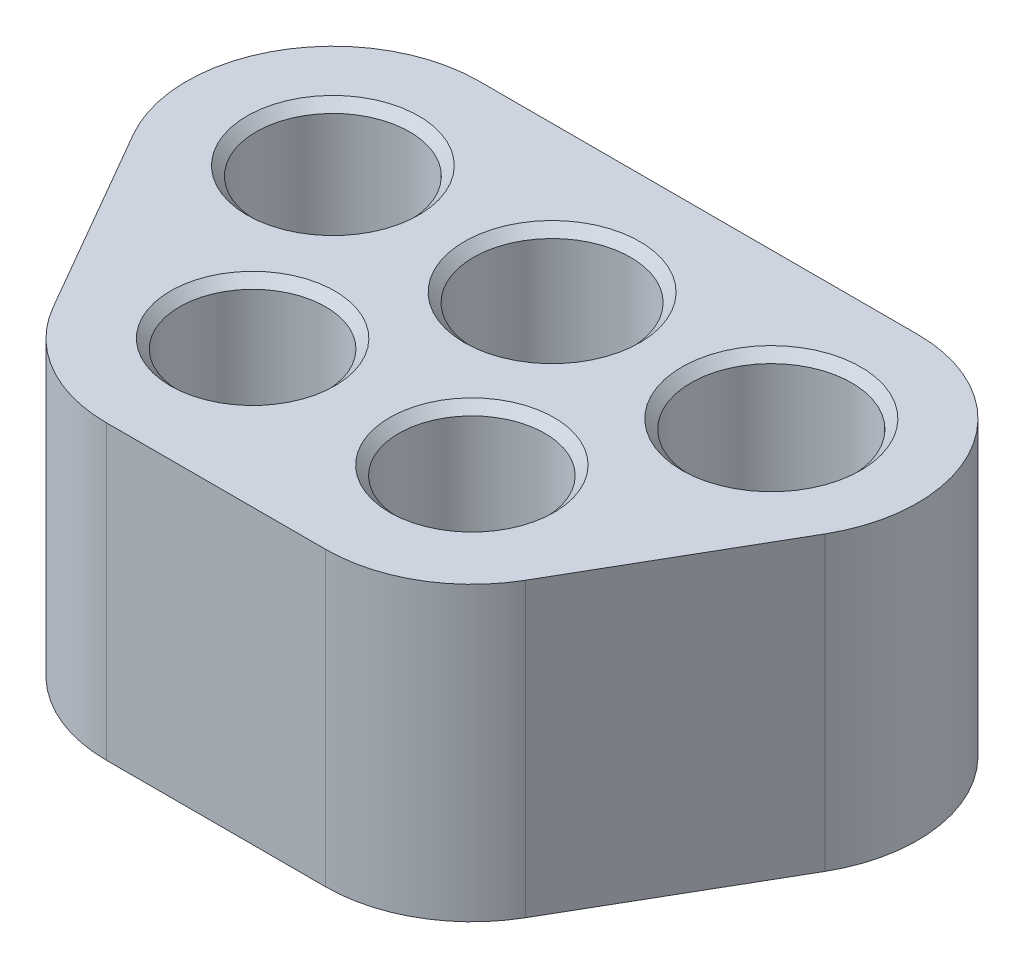
ISO-10303-21;
HEADER;
FILE_DESCRIPTION(('STEP AP214'),'2;1');
FILE_NAME('part.step','',(''),(''),'','','');
FILE_SCHEMA(('AUTOMOTIVE_DESIGN { 1 0 10303 214 1 1 1 1 }'));
ENDSEC;
DATA;
#1=APPLICATION_CONTEXT('core data for automotive mechanical design processes');
#2=APPLICATION_PROTOCOL_DEFINITION('international standard','automotive_design',2000,#1);
#3=PRODUCT_CONTEXT('',#1,'mechanical');
#4=PRODUCT('Part','Part','',(#3));
#5=PRODUCT_RELATED_PRODUCT_CATEGORY('part','',(#4));
#6=PRODUCT_DEFINITION_FORMATION('','',#4);
#7=PRODUCT_DEFINITION_CONTEXT('part definition',#1,'design');
#8=PRODUCT_DEFINITION('design','',#6,#7);
#9=PRODUCT_DEFINITION_SHAPE('','',#8);
#10=(LENGTH_UNIT() NAMED_UNIT(*) SI_UNIT(.MILLI.,.METRE.));
#11=(NAMED_UNIT(*) PLANE_ANGLE_UNIT() SI_UNIT($,.RADIAN.));
#12=(NAMED_UNIT(*) SI_UNIT($,.STERADIAN.) SOLID_ANGLE_UNIT());
#13=UNCERTAINTY_MEASURE_WITH_UNIT(LENGTH_MEASURE(1.E-05),#10,'distance_accuracy_value','');
#14=(GEOMETRIC_REPRESENTATION_CONTEXT(3) GLOBAL_UNCERTAINTY_ASSIGNED_CONTEXT((#13)) GLOBAL_UNIT_ASSIGNED_CONTEXT((#10,
#11,#12)) REPRESENTATION_CONTEXT('',''));
#15=CARTESIAN_POINT('',(0.,0.,0.));
#16=DIRECTION('',(0.,0.,1.));
#17=DIRECTION('',(1.,0.,0.));
#18=AXIS2_PLACEMENT_3D('',#15,#16,#17);
#19=CARTESIAN_POINT('',(0.,8.,0.));
#20=DIRECTION('',(0.,1.,0.));
#21=DIRECTION('',(0.,0.,1.));
#22=AXIS2_PLACEMENT_3D('',#19,#20,#21);
#23=PLANE('',#22);
#24=CARTESIAN_POINT('',(3.,8.,5.19615242270663));
#25=DIRECTION('',(0.,1.,0.));
#26=DIRECTION('',(0.,0.,1.));
#27=AXIS2_PLACEMENT_3D('',#24,#25,#26);
#28=CIRCLE('',#27,2.25000000000001);
#29=CARTESIAN_POINT('',(3.,8.,7.44615242270664));
#30=VERTEX_POINT('',#29);
#31=EDGE_CURVE('E182',#30,#30,#28,.F.);
#32=ORIENTED_EDGE('',*,*,#31,.T.);
#33=EDGE_LOOP('',(#32));
#34=FACE_BOUND('',#33,.T.);
#35=CARTESIAN_POINT('',(9.,8.,5.19615242270663));
#36=DIRECTION('',(0.,1.,0.));
#37=DIRECTION('',(0.,0.,1.));
#38=AXIS2_PLACEMENT_3D('',#35,#36,#37);
#39=CIRCLE('',#38,2.25000000000001);
#40=CARTESIAN_POINT('',(9.,8.,7.44615242270664));
#41=VERTEX_POINT('',#40);
#42=EDGE_CURVE('E179',#41,#41,#39,.F.);
#43=ORIENTED_EDGE('',*,*,#42,.T.);
#44=EDGE_LOOP('',(#43));
#45=FACE_BOUND('',#44,.T.);
#46=CARTESIAN_POINT('',(12.,8.,0.));
#47=DIRECTION('',(0.,1.,0.));
#48=DIRECTION('',(0.,0.,1.));
#49=AXIS2_PLACEMENT_3D('',#46,#47,#48);
#50=CIRCLE('',#49,2.45);
#51=CARTESIAN_POINT('',(12.,8.,2.45));
#52=VERTEX_POINT('',#51);
#53=EDGE_CURVE('E176',#52,#52,#50,.F.);
#54=ORIENTED_EDGE('',*,*,#53,.T.);
#55=EDGE_LOOP('',(#54));
#56=FACE_BOUND('',#55,.T.);
#57=CARTESIAN_POINT('',(6.,8.,0.));
#58=DIRECTION('',(0.,1.,0.));
#59=DIRECTION('',(0.,0.,1.));
#60=AXIS2_PLACEMENT_3D('',#57,#58,#59);
#61=CIRCLE('',#60,2.40000000000001);
#62=CARTESIAN_POINT('',(6.,8.,2.40000000000001));
#63=VERTEX_POINT('',#62);
#64=EDGE_CURVE('E173',#63,#63,#61,.F.);
#65=ORIENTED_EDGE('',*,*,#64,.T.);
#66=EDGE_LOOP('',(#65));
#67=FACE_BOUND('',#66,.T.);
#68=CARTESIAN_POINT('',(0.,8.,0.));
#69=DIRECTION('',(0.,1.,0.));
#70=DIRECTION('',(0.,0.,1.));
#71=AXIS2_PLACEMENT_3D('',#68,#69,#70);
#72=CIRCLE('',#71,2.35000000000001);
#73=CARTESIAN_POINT('',(0.,8.,2.35000000000001));
#74=VERTEX_POINT('',#73);
#75=EDGE_CURVE('E170',#74,#74,#72,.F.);
#76=ORIENTED_EDGE('',*,*,#75,.T.);
#77=EDGE_LOOP('',(#76));
#78=FACE_BOUND('',#77,.T.);
#79=DIRECTION('',(-1.,0.,0.));
#80=VECTOR('',#79,1.);
#81=CARTESIAN_POINT('',(18.9282032302755,8.,-4.));
#82=LINE('',#81,#80);
#83=CARTESIAN_POINT('',(12.,8.,-4.));
#84=VERTEX_POINT('',#83);
#85=CARTESIAN_POINT('',(0.,8.,-4.));
#86=VERTEX_POINT('',#85);
#87=EDGE_CURVE('E141',#84,#86,#82,.T.);
#88=ORIENTED_EDGE('',*,*,#87,.T.);
#89=CARTESIAN_POINT('',(0.,8.,0.));
#90=DIRECTION('',(0.,1.,0.));
#91=DIRECTION('',(0.,0.,1.));
#92=AXIS2_PLACEMENT_3D('',#89,#90,#91);
#93=CIRCLE('',#92,4.);
#94=CARTESIAN_POINT('',(-3.46410161513775,8.,2.));
#95=VERTEX_POINT('',#94);
#96=EDGE_CURVE('E156',#86,#95,#93,.T.);
#97=ORIENTED_EDGE('',*,*,#96,.T.);
#98=DIRECTION('',(0.5,0.,0.866025403784439));
#99=VECTOR('',#98,1.);
#100=CARTESIAN_POINT('',(-6.92820323027551,8.,-4.));
#101=LINE('',#100,#99);
#102=CARTESIAN_POINT('',(-0.464101615137753,8.,7.19615242270663));
#103=VERTEX_POINT('',#102);
#104=EDGE_CURVE('E123',#95,#103,#101,.T.);
#105=ORIENTED_EDGE('',*,*,#104,.T.);
#106=CARTESIAN_POINT('',(3.,8.,5.19615242270663));
#107=DIRECTION('',(0.,1.,0.));
#108=DIRECTION('',(0.,0.,1.));
#109=AXIS2_PLACEMENT_3D('',#106,#107,#108);
#110=CIRCLE('',#109,4.);
#111=CARTESIAN_POINT('',(3.,8.,9.19615242270663));
#112=VERTEX_POINT('',#111);
#113=EDGE_CURVE('E151',#103,#112,#110,.T.);
#114=ORIENTED_EDGE('',*,*,#113,.T.);
#115=DIRECTION('',(1.,0.,0.));
#116=VECTOR('',#115,1.);
#117=CARTESIAN_POINT('',(0.690598923241498,8.,9.19615242270663));
#118=LINE('',#117,#116);
#119=CARTESIAN_POINT('',(9.,8.,9.19615242270663));
#120=VERTEX_POINT('',#119);
#121=EDGE_CURVE('E300',#112,#120,#118,.T.);
#122=ORIENTED_EDGE('',*,*,#121,.T.);
#123=CARTESIAN_POINT('',(9.,8.,5.19615242270663));
#124=DIRECTION('',(0.,1.,0.));
#125=DIRECTION('',(0.,0.,1.));
#126=AXIS2_PLACEMENT_3D('',#123,#124,#125);
#127=CIRCLE('',#126,4.);
#128=CARTESIAN_POINT('',(12.4641016151378,8.,7.19615242270663));
#129=VERTEX_POINT('',#128);
#130=EDGE_CURVE('E58',#120,#129,#127,.T.);
#131=ORIENTED_EDGE('',*,*,#130,.T.);
#132=DIRECTION('',(0.5,0.,-0.866025403784439));
#133=VECTOR('',#132,1.);
#134=CARTESIAN_POINT('',(11.3094010767585,8.,9.19615242270663));
#135=LINE('',#134,#133);
#136=CARTESIAN_POINT('',(15.4641016151378,8.,2.));
#137=VERTEX_POINT('',#136);
#138=EDGE_CURVE('E142',#129,#137,#135,.T.);
#139=ORIENTED_EDGE('',*,*,#138,.T.);
#140=CARTESIAN_POINT('',(12.,8.,0.));
#141=DIRECTION('',(0.,1.,0.));
#142=DIRECTION('',(0.,0.,1.));
#143=AXIS2_PLACEMENT_3D('',#140,#141,#142);
#144=CIRCLE('',#143,4.);
#145=EDGE_CURVE('E154',#137,#84,#144,.T.);
#146=ORIENTED_EDGE('',*,*,#145,.T.);
#147=EDGE_LOOP('',(#88,#97,#105,#114,#122,#131,#139,#146));
#148=FACE_BOUND('',#147,.T.);
#149=ADVANCED_FACE('F35',(#34,#45,#56,#67,#78,#148),#23,.T.);
#150=CARTESIAN_POINT('',(0.,0.,0.));
#151=DIRECTION('',(0.,1.,0.));
#152=DIRECTION('',(0.,0.,1.));
#153=AXIS2_PLACEMENT_3D('',#150,#151,#152);
#154=PLANE('',#153);
#155=DIRECTION('',(0.5,0.,0.866025403784439));
#156=VECTOR('',#155,1.);
#157=CARTESIAN_POINT('',(-6.92820323027551,0.,-4.));
#158=LINE('',#157,#156);
#159=CARTESIAN_POINT('',(-3.46410161513775,0.,2.));
#160=VERTEX_POINT('',#159);
#161=CARTESIAN_POINT('',(-0.464101615137753,0.,7.19615242270663));
#162=VERTEX_POINT('',#161);
#163=EDGE_CURVE('E120',#160,#162,#158,.T.);
#164=ORIENTED_EDGE('',*,*,#163,.F.);
#165=CARTESIAN_POINT('',(0.,0.,0.));
#166=DIRECTION('',(0.,1.,0.));
#167=DIRECTION('',(0.,0.,1.));
#168=AXIS2_PLACEMENT_3D('',#165,#166,#167);
#169=CIRCLE('',#168,4.);
#170=CARTESIAN_POINT('',(0.,0.,-4.));
#171=VERTEX_POINT('',#170);
#172=EDGE_CURVE('E103',#160,#171,#169,.F.);
#173=ORIENTED_EDGE('',*,*,#172,.T.);
#174=DIRECTION('',(-1.,0.,0.));
#175=VECTOR('',#174,1.);
#176=CARTESIAN_POINT('',(18.9282032302755,0.,-4.));
#177=LINE('',#176,#175);
#178=CARTESIAN_POINT('',(12.,0.,-4.));
#179=VERTEX_POINT('',#178);
#180=EDGE_CURVE('E131',#179,#171,#177,.T.);
#181=ORIENTED_EDGE('',*,*,#180,.F.);
#182=CARTESIAN_POINT('',(12.,0.,0.));
#183=DIRECTION('',(0.,1.,0.));
#184=DIRECTION('',(0.,0.,1.));
#185=AXIS2_PLACEMENT_3D('',#182,#183,#184);
#186=CIRCLE('',#185,4.);
#187=CARTESIAN_POINT('',(15.4641016151378,0.,2.));
#188=VERTEX_POINT('',#187);
#189=EDGE_CURVE('E114',#179,#188,#186,.F.);
#190=ORIENTED_EDGE('',*,*,#189,.T.);
#191=DIRECTION('',(0.5,0.,-0.866025403784439));
#192=VECTOR('',#191,1.);
#193=CARTESIAN_POINT('',(11.3094010767585,0.,9.19615242270663));
#194=LINE('',#193,#192);
#195=CARTESIAN_POINT('',(12.4641016151378,0.,7.19615242270663));
#196=VERTEX_POINT('',#195);
#197=EDGE_CURVE('E134',#196,#188,#194,.T.);
#198=ORIENTED_EDGE('',*,*,#197,.F.);
#199=CARTESIAN_POINT('',(9.,0.,5.19615242270663));
#200=DIRECTION('',(0.,1.,0.));
#201=DIRECTION('',(0.,0.,1.));
#202=AXIS2_PLACEMENT_3D('',#199,#200,#201);
#203=CIRCLE('',#202,4.);
#204=CARTESIAN_POINT('',(9.,0.,9.19615242270663));
#205=VERTEX_POINT('',#204);
#206=EDGE_CURVE('E145',#196,#205,#203,.F.);
#207=ORIENTED_EDGE('',*,*,#206,.T.);
#208=DIRECTION('',(1.,0.,0.));
#209=VECTOR('',#208,1.);
#210=CARTESIAN_POINT('',(0.690598923241498,0.,9.19615242270663));
#211=LINE('',#210,#209);
#212=CARTESIAN_POINT('',(3.,0.,9.19615242270663));
#213=VERTEX_POINT('',#212);
#214=EDGE_CURVE('E130',#213,#205,#211,.T.);
#215=ORIENTED_EDGE('',*,*,#214,.F.);
#216=CARTESIAN_POINT('',(3.,0.,5.19615242270663));
#217=DIRECTION('',(0.,1.,0.));
#218=DIRECTION('',(0.,0.,1.));
#219=AXIS2_PLACEMENT_3D('',#216,#217,#218);
#220=CIRCLE('',#219,4.);
#221=EDGE_CURVE('E124',#213,#162,#220,.F.);
#222=ORIENTED_EDGE('',*,*,#221,.T.);
#223=EDGE_LOOP('',(#164,#173,#181,#190,#198,#207,#215,#222));
#224=FACE_BOUND('',#223,.T.);
#225=CARTESIAN_POINT('',(0.,0.,0.));
#226=DIRECTION('',(0.,1.,0.));
#227=DIRECTION('',(0.,0.,1.));
#228=AXIS2_PLACEMENT_3D('',#225,#226,#227);
#229=CIRCLE('',#228,2.1);
#230=CARTESIAN_POINT('',(0.,0.,2.1));
#231=VERTEX_POINT('',#230);
#232=EDGE_CURVE('E136',#231,#231,#229,.T.);
#233=ORIENTED_EDGE('',*,*,#232,.T.);
#234=EDGE_LOOP('',(#233));
#235=FACE_BOUND('',#234,.T.);
#236=CARTESIAN_POINT('',(6.,0.,0.));
#237=DIRECTION('',(0.,1.,0.));
#238=DIRECTION('',(0.,0.,1.));
#239=AXIS2_PLACEMENT_3D('',#236,#237,#238);
#240=CIRCLE('',#239,2.15);
#241=CARTESIAN_POINT('',(6.,0.,2.15));
#242=VERTEX_POINT('',#241);
#243=EDGE_CURVE('E288',#242,#242,#240,.T.);
#244=ORIENTED_EDGE('',*,*,#243,.T.);
#245=EDGE_LOOP('',(#244));
#246=FACE_BOUND('',#245,.T.);
#247=CARTESIAN_POINT('',(12.,0.,0.));
#248=DIRECTION('',(0.,1.,0.));
#249=DIRECTION('',(0.,0.,1.));
#250=AXIS2_PLACEMENT_3D('',#247,#248,#249);
#251=CIRCLE('',#250,2.2);
#252=CARTESIAN_POINT('',(12.,0.,2.2));
#253=VERTEX_POINT('',#252);
#254=EDGE_CURVE('E284',#253,#253,#251,.T.);
#255=ORIENTED_EDGE('',*,*,#254,.T.);
#256=EDGE_LOOP('',(#255));
#257=FACE_BOUND('',#256,.T.);
#258=CARTESIAN_POINT('',(9.,0.,5.19615242270663));
#259=DIRECTION('',(0.,1.,0.));
#260=DIRECTION('',(0.,0.,1.));
#261=AXIS2_PLACEMENT_3D('',#258,#259,#260);
#262=CIRCLE('',#261,2.);
#263=CARTESIAN_POINT('',(9.,0.,7.19615242270663));
#264=VERTEX_POINT('',#263);
#265=EDGE_CURVE('E282',#264,#264,#262,.T.);
#266=ORIENTED_EDGE('',*,*,#265,.T.);
#267=EDGE_LOOP('',(#266));
#268=FACE_BOUND('',#267,.T.);
#269=CARTESIAN_POINT('',(3.,0.,5.19615242270663));
#270=DIRECTION('',(0.,1.,0.));
#271=DIRECTION('',(0.,0.,1.));
#272=AXIS2_PLACEMENT_3D('',#269,#270,#271);
#273=CIRCLE('',#272,2.);
#274=CARTESIAN_POINT('',(3.,0.,7.19615242270664));
#275=VERTEX_POINT('',#274);
#276=EDGE_CURVE('E285',#275,#275,#273,.T.);
#277=ORIENTED_EDGE('',*,*,#276,.T.);
#278=EDGE_LOOP('',(#277));
#279=FACE_BOUND('',#278,.T.);
#280=ADVANCED_FACE('F127',(#224,#235,#246,#257,#268,#279),#154,.F.);
#281=CARTESIAN_POINT('',(18.9282032302755,8.,-4.));
#282=DIRECTION('',(0.,0.,1.));
#283=DIRECTION('',(1.,0.,0.));
#284=AXIS2_PLACEMENT_3D('',#281,#282,#283);
#285=PLANE('',#284);
#286=ORIENTED_EDGE('',*,*,#180,.T.);
#287=DIRECTION('',(0.,-1.,0.));
#288=VECTOR('',#287,1.);
#289=CARTESIAN_POINT('',(0.,8.,-4.));
#290=LINE('',#289,#288);
#291=EDGE_CURVE('E108',#171,#86,#290,.F.);
#292=ORIENTED_EDGE('',*,*,#291,.T.);
#293=ORIENTED_EDGE('',*,*,#87,.F.);
#294=DIRECTION('',(0.,-1.,0.));
#295=VECTOR('',#294,1.);
#296=CARTESIAN_POINT('',(12.,8.,-4.));
#297=LINE('',#296,#295);
#298=EDGE_CURVE('E113',#84,#179,#297,.T.);
#299=ORIENTED_EDGE('',*,*,#298,.T.);
#300=EDGE_LOOP('',(#286,#292,#293,#299));
#301=FACE_BOUND('',#300,.T.);
#302=ADVANCED_FACE('F216',(#301),#285,.F.);
#303=CARTESIAN_POINT('',(-6.92820323027551,8.,-4.));
#304=DIRECTION('',(0.866025403784439,0.,-0.5));
#305=DIRECTION('',(-0.5,0.,-0.866025403784439));
#306=AXIS2_PLACEMENT_3D('',#303,#304,#305);
#307=PLANE('',#306);
#308=ORIENTED_EDGE('',*,*,#104,.F.);
#309=DIRECTION('',(0.,-1.,0.));
#310=VECTOR('',#309,1.);
#311=CARTESIAN_POINT('',(-3.46410161513775,8.,2.));
#312=LINE('',#311,#310);
#313=EDGE_CURVE('E107',#95,#160,#312,.T.);
#314=ORIENTED_EDGE('',*,*,#313,.T.);
#315=ORIENTED_EDGE('',*,*,#163,.T.);
#316=DIRECTION('',(0.,-1.,0.));
#317=VECTOR('',#316,1.);
#318=CARTESIAN_POINT('',(-0.464101615137754,8.,7.19615242270663));
#319=LINE('',#318,#317);
#320=EDGE_CURVE('E125',#162,#103,#319,.F.);
#321=ORIENTED_EDGE('',*,*,#320,.T.);
#322=EDGE_LOOP('',(#308,#314,#315,#321));
#323=FACE_BOUND('',#322,.T.);
#324=ADVANCED_FACE('F119',(#323),#307,.F.);
#325=CARTESIAN_POINT('',(0.690598923241498,8.,9.19615242270663));
#326=DIRECTION('',(0.,0.,-1.));
#327=DIRECTION('',(-1.,0.,0.));
#328=AXIS2_PLACEMENT_3D('',#325,#326,#327);
#329=PLANE('',#328);
#330=ORIENTED_EDGE('',*,*,#214,.T.);
#331=DIRECTION('',(0.,-1.,0.));
#332=VECTOR('',#331,1.);
#333=CARTESIAN_POINT('',(9.,8.,9.19615242270663));
#334=LINE('',#333,#332);
#335=EDGE_CURVE('E165',#205,#120,#334,.F.);
#336=ORIENTED_EDGE('',*,*,#335,.T.);
#337=ORIENTED_EDGE('',*,*,#121,.F.);
#338=DIRECTION('',(0.,-1.,0.));
#339=VECTOR('',#338,1.);
#340=CARTESIAN_POINT('',(3.,8.,9.19615242270663));
#341=LINE('',#340,#339);
#342=EDGE_CURVE('E162',#112,#213,#341,.T.);
#343=ORIENTED_EDGE('',*,*,#342,.T.);
#344=EDGE_LOOP('',(#330,#336,#337,#343));
#345=FACE_BOUND('',#344,.T.);
#346=ADVANCED_FACE('F226',(#345),#329,.F.);
#347=CARTESIAN_POINT('',(11.3094010767585,8.,9.19615242270663));
#348=DIRECTION('',(-0.866025403784439,0.,-0.5));
#349=DIRECTION('',(-0.5,0.,0.866025403784439));
#350=AXIS2_PLACEMENT_3D('',#347,#348,#349);
#351=PLANE('',#350);
#352=ORIENTED_EDGE('',*,*,#197,.T.);
#353=DIRECTION('',(0.,-1.,0.));
#354=VECTOR('',#353,1.);
#355=CARTESIAN_POINT('',(15.4641016151378,8.,2.));
#356=LINE('',#355,#354);
#357=EDGE_CURVE('E51',#188,#137,#356,.F.);
#358=ORIENTED_EDGE('',*,*,#357,.T.);
#359=ORIENTED_EDGE('',*,*,#138,.F.);
#360=DIRECTION('',(0.,-1.,0.));
#361=VECTOR('',#360,1.);
#362=CARTESIAN_POINT('',(12.4641016151378,8.,7.19615242270663));
#363=LINE('',#362,#361);
#364=EDGE_CURVE('E158',#129,#196,#363,.T.);
#365=ORIENTED_EDGE('',*,*,#364,.T.);
#366=EDGE_LOOP('',(#352,#358,#359,#365));
#367=FACE_BOUND('',#366,.T.);
#368=ADVANCED_FACE('F223',(#367),#351,.F.);
#369=CARTESIAN_POINT('',(0.,8.,0.));
#370=DIRECTION('',(0.,-1.,0.));
#371=DIRECTION('',(0.,0.,-1.));
#372=AXIS2_PLACEMENT_3D('',#369,#370,#371);
#373=CYLINDRICAL_SURFACE('',#372,2.1);
#374=CARTESIAN_POINT('',(0.,7.75,0.));
#375=DIRECTION('',(0.,1.,0.));
#376=DIRECTION('',(0.,0.,1.));
#377=AXIS2_PLACEMENT_3D('',#374,#375,#376);
#378=CIRCLE('',#377,2.1);
#379=CARTESIAN_POINT('',(0.,7.75,2.1));
#380=VERTEX_POINT('',#379);
#381=EDGE_CURVE('E11',#380,#380,#378,.T.);
#382=ORIENTED_EDGE('',*,*,#381,.T.);
#383=EDGE_LOOP('',(#382));
#384=FACE_BOUND('',#383,.T.);
#385=ORIENTED_EDGE('',*,*,#232,.F.);
#386=EDGE_LOOP('',(#385));
#387=FACE_BOUND('',#386,.T.);
#388=ADVANCED_FACE('F220',(#384,#387),#373,.F.);
#389=CARTESIAN_POINT('',(6.,8.,0.));
#390=DIRECTION('',(0.,-1.,0.));
#391=DIRECTION('',(0.,0.,-1.));
#392=AXIS2_PLACEMENT_3D('',#389,#390,#391);
#393=CYLINDRICAL_SURFACE('',#392,2.15);
#394=CARTESIAN_POINT('',(6.,7.75,0.));
#395=DIRECTION('',(0.,1.,0.));
#396=DIRECTION('',(0.,0.,1.));
#397=AXIS2_PLACEMENT_3D('',#394,#395,#396);
#398=CIRCLE('',#397,2.15);
#399=CARTESIAN_POINT('',(6.,7.75,2.15));
#400=VERTEX_POINT('',#399);
#401=EDGE_CURVE('E44',#400,#400,#398,.T.);
#402=ORIENTED_EDGE('',*,*,#401,.T.);
#403=EDGE_LOOP('',(#402));
#404=FACE_BOUND('',#403,.T.);
#405=ORIENTED_EDGE('',*,*,#243,.F.);
#406=EDGE_LOOP('',(#405));
#407=FACE_BOUND('',#406,.T.);
#408=ADVANCED_FACE('F193',(#404,#407),#393,.F.);
#409=CARTESIAN_POINT('',(12.,8.,0.));
#410=DIRECTION('',(0.,-1.,0.));
#411=DIRECTION('',(0.,0.,-1.));
#412=AXIS2_PLACEMENT_3D('',#409,#410,#411);
#413=CYLINDRICAL_SURFACE('',#412,2.2);
#414=CARTESIAN_POINT('',(12.,7.75,0.));
#415=DIRECTION('',(0.,1.,0.));
#416=DIRECTION('',(0.,0.,1.));
#417=AXIS2_PLACEMENT_3D('',#414,#415,#416);
#418=CIRCLE('',#417,2.2);
#419=CARTESIAN_POINT('',(12.,7.75,2.2));
#420=VERTEX_POINT('',#419);
#421=EDGE_CURVE('E188',#420,#420,#418,.T.);
#422=ORIENTED_EDGE('',*,*,#421,.T.);
#423=EDGE_LOOP('',(#422));
#424=FACE_BOUND('',#423,.T.);
#425=ORIENTED_EDGE('',*,*,#254,.F.);
#426=EDGE_LOOP('',(#425));
#427=FACE_BOUND('',#426,.T.);
#428=ADVANCED_FACE('F278',(#424,#427),#413,.F.);
#429=CARTESIAN_POINT('',(9.,8.,5.19615242270663));
#430=DIRECTION('',(0.,-1.,0.));
#431=DIRECTION('',(0.,0.,-1.));
#432=AXIS2_PLACEMENT_3D('',#429,#430,#431);
#433=CYLINDRICAL_SURFACE('',#432,2.);
#434=CARTESIAN_POINT('',(9.,7.75,5.19615242270663));
#435=DIRECTION('',(0.,1.,0.));
#436=DIRECTION('',(0.,0.,1.));
#437=AXIS2_PLACEMENT_3D('',#434,#435,#436);
#438=CIRCLE('',#437,2.);
#439=CARTESIAN_POINT('',(9.,7.75,7.19615242270663));
#440=VERTEX_POINT('',#439);
#441=EDGE_CURVE('E185',#440,#440,#438,.T.);
#442=ORIENTED_EDGE('',*,*,#441,.T.);
#443=EDGE_LOOP('',(#442));
#444=FACE_BOUND('',#443,.T.);
#445=ORIENTED_EDGE('',*,*,#265,.F.);
#446=EDGE_LOOP('',(#445));
#447=FACE_BOUND('',#446,.T.);
#448=ADVANCED_FACE('F275',(#444,#447),#433,.F.);
#449=CARTESIAN_POINT('',(3.,8.,5.19615242270663));
#450=DIRECTION('',(0.,-1.,0.));
#451=DIRECTION('',(0.,0.,-1.));
#452=AXIS2_PLACEMENT_3D('',#449,#450,#451);
#453=CYLINDRICAL_SURFACE('',#452,2.);
#454=CARTESIAN_POINT('',(3.,7.75,5.19615242270663));
#455=DIRECTION('',(0.,1.,0.));
#456=DIRECTION('',(0.,0.,1.));
#457=AXIS2_PLACEMENT_3D('',#454,#455,#456);
#458=CIRCLE('',#457,2.);
#459=CARTESIAN_POINT('',(3.,7.75,7.19615242270664));
#460=VERTEX_POINT('',#459);
#461=EDGE_CURVE('E167',#460,#460,#458,.T.);
#462=ORIENTED_EDGE('',*,*,#461,.T.);
#463=EDGE_LOOP('',(#462));
#464=FACE_BOUND('',#463,.T.);
#465=ORIENTED_EDGE('',*,*,#276,.F.);
#466=EDGE_LOOP('',(#465));
#467=FACE_BOUND('',#466,.T.);
#468=ADVANCED_FACE('F238',(#464,#467),#453,.F.);
#469=CARTESIAN_POINT('',(0.,8.,0.));
#470=DIRECTION('',(0.,-1.,0.));
#471=DIRECTION('',(0.,0.,-1.));
#472=AXIS2_PLACEMENT_3D('',#469,#470,#471);
#473=CYLINDRICAL_SURFACE('',#472,4.);
#474=ORIENTED_EDGE('',*,*,#96,.F.);
#475=ORIENTED_EDGE('',*,*,#291,.F.);
#476=ORIENTED_EDGE('',*,*,#172,.F.);
#477=ORIENTED_EDGE('',*,*,#313,.F.);
#478=EDGE_LOOP('',(#474,#475,#476,#477));
#479=FACE_BOUND('',#478,.T.);
#480=ADVANCED_FACE('F106',(#479),#473,.T.);
#481=CARTESIAN_POINT('',(12.,8.,0.));
#482=DIRECTION('',(0.,-1.,0.));
#483=DIRECTION('',(0.,0.,-1.));
#484=AXIS2_PLACEMENT_3D('',#481,#482,#483);
#485=CYLINDRICAL_SURFACE('',#484,4.);
#486=ORIENTED_EDGE('',*,*,#145,.F.);
#487=ORIENTED_EDGE('',*,*,#357,.F.);
#488=ORIENTED_EDGE('',*,*,#189,.F.);
#489=ORIENTED_EDGE('',*,*,#298,.F.);
#490=EDGE_LOOP('',(#486,#487,#488,#489));
#491=FACE_BOUND('',#490,.T.);
#492=ADVANCED_FACE('F237',(#491),#485,.T.);
#493=CARTESIAN_POINT('',(9.,8.,5.19615242270663));
#494=DIRECTION('',(0.,-1.,0.));
#495=DIRECTION('',(0.,0.,-1.));
#496=AXIS2_PLACEMENT_3D('',#493,#494,#495);
#497=CYLINDRICAL_SURFACE('',#496,4.);
#498=ORIENTED_EDGE('',*,*,#130,.F.);
#499=ORIENTED_EDGE('',*,*,#335,.F.);
#500=ORIENTED_EDGE('',*,*,#206,.F.);
#501=ORIENTED_EDGE('',*,*,#364,.F.);
#502=EDGE_LOOP('',(#498,#499,#500,#501));
#503=FACE_BOUND('',#502,.T.);
#504=ADVANCED_FACE('F241',(#503),#497,.T.);
#505=CARTESIAN_POINT('',(3.,8.,5.19615242270663));
#506=DIRECTION('',(0.,-1.,0.));
#507=DIRECTION('',(0.,0.,-1.));
#508=AXIS2_PLACEMENT_3D('',#505,#506,#507);
#509=CYLINDRICAL_SURFACE('',#508,4.);
#510=ORIENTED_EDGE('',*,*,#113,.F.);
#511=ORIENTED_EDGE('',*,*,#320,.F.);
#512=ORIENTED_EDGE('',*,*,#221,.F.);
#513=ORIENTED_EDGE('',*,*,#342,.F.);
#514=EDGE_LOOP('',(#510,#511,#512,#513));
#515=FACE_BOUND('',#514,.T.);
#516=ADVANCED_FACE('F245',(#515),#509,.T.);
#517=CARTESIAN_POINT('',(3.,7.75,5.19615242270663));
#518=DIRECTION('',(0.,1.,0.));
#519=DIRECTION('',(0.,0.,1.));
#520=AXIS2_PLACEMENT_3D('',#517,#518,#519);
#521=CONICAL_SURFACE('',#520,2.,0.785398163397455);
#522=ORIENTED_EDGE('',*,*,#31,.F.);
#523=EDGE_LOOP('',(#522));
#524=FACE_BOUND('',#523,.T.);
#525=ORIENTED_EDGE('',*,*,#461,.F.);
#526=EDGE_LOOP('',(#525));
#527=FACE_BOUND('',#526,.T.);
#528=ADVANCED_FACE('F249',(#524,#527),#521,.F.);
#529=CARTESIAN_POINT('',(9.,7.75,5.19615242270663));
#530=DIRECTION('',(0.,1.,0.));
#531=DIRECTION('',(0.,0.,1.));
#532=AXIS2_PLACEMENT_3D('',#529,#530,#531);
#533=CONICAL_SURFACE('',#532,2.,0.785398163397456);
#534=ORIENTED_EDGE('',*,*,#42,.F.);
#535=EDGE_LOOP('',(#534));
#536=FACE_BOUND('',#535,.T.);
#537=ORIENTED_EDGE('',*,*,#441,.F.);
#538=EDGE_LOOP('',(#537));
#539=FACE_BOUND('',#538,.T.);
#540=ADVANCED_FACE('F205',(#536,#539),#533,.F.);
#541=CARTESIAN_POINT('',(12.,7.75,0.));
#542=DIRECTION('',(0.,1.,0.));
#543=DIRECTION('',(0.,0.,1.));
#544=AXIS2_PLACEMENT_3D('',#541,#542,#543);
#545=CONICAL_SURFACE('',#544,2.2,0.785398163397451);
#546=ORIENTED_EDGE('',*,*,#53,.F.);
#547=EDGE_LOOP('',(#546));
#548=FACE_BOUND('',#547,.T.);
#549=ORIENTED_EDGE('',*,*,#421,.F.);
#550=EDGE_LOOP('',(#549));
#551=FACE_BOUND('',#550,.T.);
#552=ADVANCED_FACE('F198',(#548,#551),#545,.F.);
#553=CARTESIAN_POINT('',(6.,7.75,0.));
#554=DIRECTION('',(0.,1.,0.));
#555=DIRECTION('',(0.,0.,1.));
#556=AXIS2_PLACEMENT_3D('',#553,#554,#555);
#557=CONICAL_SURFACE('',#556,2.15,0.785398163397459);
#558=ORIENTED_EDGE('',*,*,#64,.F.);
#559=EDGE_LOOP('',(#558));
#560=FACE_BOUND('',#559,.T.);
#561=ORIENTED_EDGE('',*,*,#401,.F.);
#562=EDGE_LOOP('',(#561));
#563=FACE_BOUND('',#562,.T.);
#564=ADVANCED_FACE('F196',(#560,#563),#557,.F.);
#565=CARTESIAN_POINT('',(0.,7.75,0.));
#566=DIRECTION('',(0.,1.,0.));
#567=DIRECTION('',(0.,0.,1.));
#568=AXIS2_PLACEMENT_3D('',#565,#566,#567);
#569=CONICAL_SURFACE('',#568,2.1,0.78539816339746);
#570=ORIENTED_EDGE('',*,*,#75,.F.);
#571=EDGE_LOOP('',(#570));
#572=FACE_BOUND('',#571,.T.);
#573=ORIENTED_EDGE('',*,*,#381,.F.);
#574=EDGE_LOOP('',(#573));
#575=FACE_BOUND('',#574,.T.);
#576=ADVANCED_FACE('F38',(#572,#575),#569,.F.);
#577=CLOSED_SHELL('',(#149,#280,#302,#324,#346,#368,#388,#408,#428,#448,#468,#480,#492,#504,
#516,#528,#540,#552,#564,#576));
#578=MANIFOLD_SOLID_BREP('B2',#577);
#579=ADVANCED_BREP_SHAPE_REPRESENTATION('',(#18,#578),#14);
#580=SHAPE_DEFINITION_REPRESENTATION(#9,#579);
ENDSEC;
END-ISO-10303-21;
